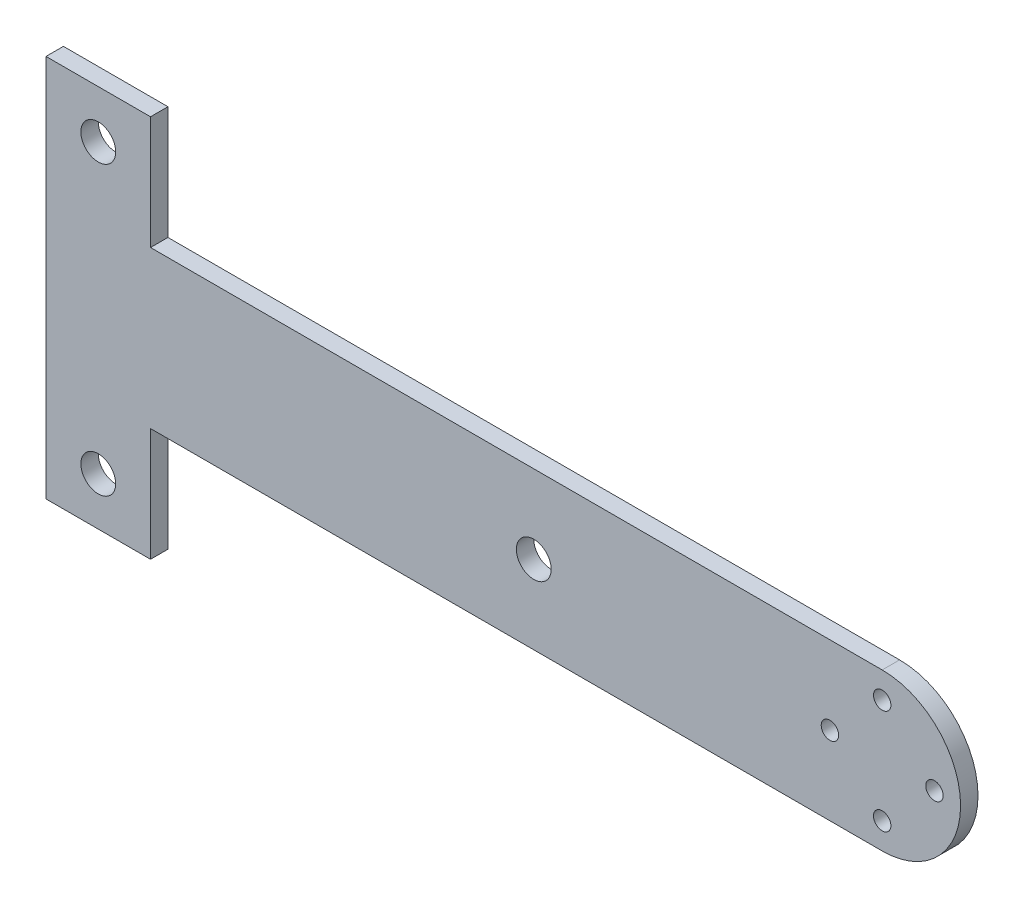
ISO-10303-21;
HEADER;
FILE_DESCRIPTION(('STEP AP214'),'2;1');
FILE_NAME('part.step','',(''),(''),'','','');
FILE_SCHEMA(('AUTOMOTIVE_DESIGN { 1 0 10303 214 1 1 1 1 }'));
ENDSEC;
DATA;
#1=APPLICATION_CONTEXT('core data for automotive mechanical design processes');
#2=APPLICATION_PROTOCOL_DEFINITION('international standard','automotive_design',2000,#1);
#3=PRODUCT_CONTEXT('',#1,'mechanical');
#4=PRODUCT('Part','Part','',(#3));
#5=PRODUCT_RELATED_PRODUCT_CATEGORY('part','',(#4));
#6=PRODUCT_DEFINITION_FORMATION('','',#4);
#7=PRODUCT_DEFINITION_CONTEXT('part definition',#1,'design');
#8=PRODUCT_DEFINITION('design','',#6,#7);
#9=PRODUCT_DEFINITION_SHAPE('','',#8);
#10=(LENGTH_UNIT() NAMED_UNIT(*) SI_UNIT(.MILLI.,.METRE.));
#11=(NAMED_UNIT(*) PLANE_ANGLE_UNIT() SI_UNIT($,.RADIAN.));
#12=(NAMED_UNIT(*) SI_UNIT($,.STERADIAN.) SOLID_ANGLE_UNIT());
#13=UNCERTAINTY_MEASURE_WITH_UNIT(LENGTH_MEASURE(1.E-05),#10,'distance_accuracy_value','');
#14=(GEOMETRIC_REPRESENTATION_CONTEXT(3) GLOBAL_UNCERTAINTY_ASSIGNED_CONTEXT((#13)) GLOBAL_UNIT_ASSIGNED_CONTEXT((#10,
#11,#12)) REPRESENTATION_CONTEXT('',''));
#15=CARTESIAN_POINT('',(0.,0.,0.));
#16=DIRECTION('',(0.,0.,1.));
#17=DIRECTION('',(1.,0.,0.));
#18=AXIS2_PLACEMENT_3D('',#15,#16,#17);
#19=CARTESIAN_POINT('',(41.2764285714286,0.145714285714315,2.));
#20=DIRECTION('',(0.,0.,-1.));
#21=DIRECTION('',(-1.,0.,0.));
#22=AXIS2_PLACEMENT_3D('',#19,#20,#21);
#23=CYLINDRICAL_SURFACE('',#22,9.);
#24=CARTESIAN_POINT('',(41.2764285714286,0.145714285714315,0.));
#25=DIRECTION('',(0.,0.,1.));
#26=DIRECTION('',(1.,0.,0.));
#27=AXIS2_PLACEMENT_3D('',#24,#25,#26);
#28=CIRCLE('',#27,9.);
#29=CARTESIAN_POINT('',(41.2764285714286,9.14571428571432,0.));
#30=VERTEX_POINT('',#29);
#31=CARTESIAN_POINT('',(41.2764285714286,-8.85428571428569,0.));
#32=VERTEX_POINT('',#31);
#33=EDGE_CURVE('E168',#30,#32,#28,.F.);
#34=ORIENTED_EDGE('',*,*,#33,.F.);
#35=DIRECTION('',(0.,0.,-1.));
#36=VECTOR('',#35,1.);
#37=CARTESIAN_POINT('',(41.2764285714286,9.14571428571432,2.));
#38=LINE('',#37,#36);
#39=CARTESIAN_POINT('',(41.2764285714286,9.14571428571432,2.));
#40=VERTEX_POINT('',#39);
#41=EDGE_CURVE('E11',#40,#30,#38,.T.);
#42=ORIENTED_EDGE('',*,*,#41,.F.);
#43=CARTESIAN_POINT('',(41.2764285714286,0.145714285714315,2.));
#44=DIRECTION('',(0.,0.,1.));
#45=DIRECTION('',(1.,0.,0.));
#46=AXIS2_PLACEMENT_3D('',#43,#44,#45);
#47=CIRCLE('',#46,9.);
#48=CARTESIAN_POINT('',(41.2764285714286,-8.85428571428569,2.));
#49=VERTEX_POINT('',#48);
#50=EDGE_CURVE('E297',#40,#49,#47,.F.);
#51=ORIENTED_EDGE('',*,*,#50,.T.);
#52=DIRECTION('',(0.,0.,-1.));
#53=VECTOR('',#52,1.);
#54=CARTESIAN_POINT('',(41.2764285714286,-8.85428571428569,2.));
#55=LINE('',#54,#53);
#56=EDGE_CURVE('E59',#49,#32,#55,.T.);
#57=ORIENTED_EDGE('',*,*,#56,.T.);
#58=EDGE_LOOP('',(#34,#42,#51,#57));
#59=FACE_BOUND('',#58,.T.);
#60=ADVANCED_FACE('F41',(#59),#23,.T.);
#61=CARTESIAN_POINT('',(0.,9.14571428571431,2.));
#62=DIRECTION('',(0.,-1.,0.));
#63=DIRECTION('',(1.,0.,0.));
#64=AXIS2_PLACEMENT_3D('',#61,#62,#63);
#65=PLANE('',#64);
#66=DIRECTION('',(-1.,0.,0.));
#67=VECTOR('',#66,1.);
#68=CARTESIAN_POINT('',(0.,9.14571428571431,0.));
#69=LINE('',#68,#67);
#70=CARTESIAN_POINT('',(-42.7235714285714,9.14571428571431,0.));
#71=VERTEX_POINT('',#70);
#72=EDGE_CURVE('E164',#30,#71,#69,.T.);
#73=ORIENTED_EDGE('',*,*,#72,.T.);
#74=DIRECTION('',(0.,0.,-1.));
#75=VECTOR('',#74,1.);
#76=CARTESIAN_POINT('',(-42.7235714285714,9.14571428571431,2.));
#77=LINE('',#76,#75);
#78=CARTESIAN_POINT('',(-42.7235714285714,9.14571428571431,2.));
#79=VERTEX_POINT('',#78);
#80=EDGE_CURVE('E51',#79,#71,#77,.T.);
#81=ORIENTED_EDGE('',*,*,#80,.F.);
#82=DIRECTION('',(-1.,0.,0.));
#83=VECTOR('',#82,1.);
#84=CARTESIAN_POINT('',(0.,9.14571428571431,2.));
#85=LINE('',#84,#83);
#86=EDGE_CURVE('E300',#40,#79,#85,.T.);
#87=ORIENTED_EDGE('',*,*,#86,.F.);
#88=ORIENTED_EDGE('',*,*,#41,.T.);
#89=EDGE_LOOP('',(#73,#81,#87,#88));
#90=FACE_BOUND('',#89,.T.);
#91=ADVANCED_FACE('F165',(#90),#65,.F.);
#92=CARTESIAN_POINT('',(-42.7235714285714,0.,2.));
#93=DIRECTION('',(-1.,0.,0.));
#94=DIRECTION('',(0.,0.,1.));
#95=AXIS2_PLACEMENT_3D('',#92,#93,#94);
#96=PLANE('',#95);
#97=DIRECTION('',(0.,1.,0.));
#98=VECTOR('',#97,1.);
#99=CARTESIAN_POINT('',(-42.7235714285714,0.,0.));
#100=LINE('',#99,#98);
#101=CARTESIAN_POINT('',(-42.7235714285714,22.1457142857143,0.));
#102=VERTEX_POINT('',#101);
#103=EDGE_CURVE('E158',#71,#102,#100,.T.);
#104=ORIENTED_EDGE('',*,*,#103,.T.);
#105=DIRECTION('',(0.,0.,-1.));
#106=VECTOR('',#105,1.);
#107=CARTESIAN_POINT('',(-42.7235714285714,22.1457142857143,2.));
#108=LINE('',#107,#106);
#109=CARTESIAN_POINT('',(-42.7235714285714,22.1457142857143,2.));
#110=VERTEX_POINT('',#109);
#111=EDGE_CURVE('E147',#110,#102,#108,.T.);
#112=ORIENTED_EDGE('',*,*,#111,.F.);
#113=DIRECTION('',(0.,1.,0.));
#114=VECTOR('',#113,1.);
#115=CARTESIAN_POINT('',(-42.7235714285714,0.,2.));
#116=LINE('',#115,#114);
#117=EDGE_CURVE('E160',#79,#110,#116,.T.);
#118=ORIENTED_EDGE('',*,*,#117,.F.);
#119=ORIENTED_EDGE('',*,*,#80,.T.);
#120=EDGE_LOOP('',(#104,#112,#118,#119));
#121=FACE_BOUND('',#120,.T.);
#122=ADVANCED_FACE('F156',(#121),#96,.F.);
#123=CARTESIAN_POINT('',(0.,22.1457142857143,2.));
#124=DIRECTION('',(0.,-1.,0.));
#125=DIRECTION('',(0.,0.,-1.));
#126=AXIS2_PLACEMENT_3D('',#123,#124,#125);
#127=PLANE('',#126);
#128=DIRECTION('',(-1.,0.,0.));
#129=VECTOR('',#128,1.);
#130=CARTESIAN_POINT('',(0.,22.1457142857143,0.));
#131=LINE('',#130,#129);
#132=CARTESIAN_POINT('',(-54.7235714285714,22.1457142857143,0.));
#133=VERTEX_POINT('',#132);
#134=EDGE_CURVE('E172',#102,#133,#131,.T.);
#135=ORIENTED_EDGE('',*,*,#134,.T.);
#136=DIRECTION('',(0.,0.,-1.));
#137=VECTOR('',#136,1.);
#138=CARTESIAN_POINT('',(-54.7235714285714,22.1457142857143,2.));
#139=LINE('',#138,#137);
#140=CARTESIAN_POINT('',(-54.7235714285714,22.1457142857143,2.));
#141=VERTEX_POINT('',#140);
#142=EDGE_CURVE('E139',#141,#133,#139,.T.);
#143=ORIENTED_EDGE('',*,*,#142,.F.);
#144=DIRECTION('',(-1.,0.,0.));
#145=VECTOR('',#144,1.);
#146=CARTESIAN_POINT('',(0.,22.1457142857143,2.));
#147=LINE('',#146,#145);
#148=EDGE_CURVE('E307',#110,#141,#147,.T.);
#149=ORIENTED_EDGE('',*,*,#148,.F.);
#150=ORIENTED_EDGE('',*,*,#111,.T.);
#151=EDGE_LOOP('',(#135,#143,#149,#150));
#152=FACE_BOUND('',#151,.T.);
#153=ADVANCED_FACE('F258',(#152),#127,.F.);
#154=CARTESIAN_POINT('',(-54.7235714285714,0.,2.));
#155=DIRECTION('',(1.,0.,0.));
#156=DIRECTION('',(0.,0.,-1.));
#157=AXIS2_PLACEMENT_3D('',#154,#155,#156);
#158=PLANE('',#157);
#159=DIRECTION('',(0.,-1.,0.));
#160=VECTOR('',#159,1.);
#161=CARTESIAN_POINT('',(-54.7235714285714,0.,0.));
#162=LINE('',#161,#160);
#163=CARTESIAN_POINT('',(-54.7235714285714,-21.8542857142857,0.));
#164=VERTEX_POINT('',#163);
#165=EDGE_CURVE('E181',#133,#164,#162,.T.);
#166=ORIENTED_EDGE('',*,*,#165,.T.);
#167=DIRECTION('',(0.,0.,-1.));
#168=VECTOR('',#167,1.);
#169=CARTESIAN_POINT('',(-54.7235714285714,-21.8542857142857,2.));
#170=LINE('',#169,#168);
#171=CARTESIAN_POINT('',(-54.7235714285714,-21.8542857142857,2.));
#172=VERTEX_POINT('',#171);
#173=EDGE_CURVE('E135',#172,#164,#170,.T.);
#174=ORIENTED_EDGE('',*,*,#173,.F.);
#175=DIRECTION('',(0.,-1.,0.));
#176=VECTOR('',#175,1.);
#177=CARTESIAN_POINT('',(-54.7235714285714,0.,2.));
#178=LINE('',#177,#176);
#179=EDGE_CURVE('E126',#141,#172,#178,.T.);
#180=ORIENTED_EDGE('',*,*,#179,.F.);
#181=ORIENTED_EDGE('',*,*,#142,.T.);
#182=EDGE_LOOP('',(#166,#174,#180,#181));
#183=FACE_BOUND('',#182,.T.);
#184=ADVANCED_FACE('F261',(#183),#158,.F.);
#185=CARTESIAN_POINT('',(0.,-21.8542857142857,2.));
#186=DIRECTION('',(0.,1.,0.));
#187=DIRECTION('',(0.,0.,1.));
#188=AXIS2_PLACEMENT_3D('',#185,#186,#187);
#189=PLANE('',#188);
#190=DIRECTION('',(1.,0.,0.));
#191=VECTOR('',#190,1.);
#192=CARTESIAN_POINT('',(0.,-21.8542857142857,0.));
#193=LINE('',#192,#191);
#194=CARTESIAN_POINT('',(-42.7235714285714,-21.8542857142857,0.));
#195=VERTEX_POINT('',#194);
#196=EDGE_CURVE('E133',#164,#195,#193,.T.);
#197=ORIENTED_EDGE('',*,*,#196,.T.);
#198=DIRECTION('',(0.,0.,-1.));
#199=VECTOR('',#198,1.);
#200=CARTESIAN_POINT('',(-42.7235714285714,-21.8542857142857,2.));
#201=LINE('',#200,#199);
#202=CARTESIAN_POINT('',(-42.7235714285714,-21.8542857142857,2.));
#203=VERTEX_POINT('',#202);
#204=EDGE_CURVE('E113',#203,#195,#201,.T.);
#205=ORIENTED_EDGE('',*,*,#204,.F.);
#206=DIRECTION('',(1.,0.,0.));
#207=VECTOR('',#206,1.);
#208=CARTESIAN_POINT('',(0.,-21.8542857142857,2.));
#209=LINE('',#208,#207);
#210=EDGE_CURVE('E119',#172,#203,#209,.T.);
#211=ORIENTED_EDGE('',*,*,#210,.F.);
#212=ORIENTED_EDGE('',*,*,#173,.T.);
#213=EDGE_LOOP('',(#197,#205,#211,#212));
#214=FACE_BOUND('',#213,.T.);
#215=ADVANCED_FACE('F132',(#214),#189,.F.);
#216=CARTESIAN_POINT('',(-42.7235714285714,0.,2.));
#217=DIRECTION('',(-1.,0.,0.));
#218=DIRECTION('',(0.,-1.,0.));
#219=AXIS2_PLACEMENT_3D('',#216,#217,#218);
#220=PLANE('',#219);
#221=DIRECTION('',(0.,1.,0.));
#222=VECTOR('',#221,1.);
#223=CARTESIAN_POINT('',(-42.7235714285714,0.,0.));
#224=LINE('',#223,#222);
#225=CARTESIAN_POINT('',(-42.7235714285714,-8.8542857142857,0.));
#226=VERTEX_POINT('',#225);
#227=EDGE_CURVE('E187',#195,#226,#224,.T.);
#228=ORIENTED_EDGE('',*,*,#227,.T.);
#229=DIRECTION('',(0.,0.,-1.));
#230=VECTOR('',#229,1.);
#231=CARTESIAN_POINT('',(-42.7235714285714,-8.8542857142857,2.));
#232=LINE('',#231,#230);
#233=CARTESIAN_POINT('',(-42.7235714285714,-8.8542857142857,2.));
#234=VERTEX_POINT('',#233);
#235=EDGE_CURVE('E85',#234,#226,#232,.T.);
#236=ORIENTED_EDGE('',*,*,#235,.F.);
#237=DIRECTION('',(0.,1.,0.));
#238=VECTOR('',#237,1.);
#239=CARTESIAN_POINT('',(-42.7235714285714,0.,2.));
#240=LINE('',#239,#238);
#241=EDGE_CURVE('E109',#203,#234,#240,.T.);
#242=ORIENTED_EDGE('',*,*,#241,.F.);
#243=ORIENTED_EDGE('',*,*,#204,.T.);
#244=EDGE_LOOP('',(#228,#236,#242,#243));
#245=FACE_BOUND('',#244,.T.);
#246=ADVANCED_FACE('F111',(#245),#220,.F.);
#247=CARTESIAN_POINT('',(-48.7235714285714,16.6457142857143,2.));
#248=DIRECTION('',(0.,0.,-1.));
#249=DIRECTION('',(-1.,0.,0.));
#250=AXIS2_PLACEMENT_3D('',#247,#248,#249);
#251=CYLINDRICAL_SURFACE('',#250,2.);
#252=CARTESIAN_POINT('',(-48.7235714285714,16.6457142857143,2.));
#253=DIRECTION('',(0.,0.,1.));
#254=DIRECTION('',(1.,0.,0.));
#255=AXIS2_PLACEMENT_3D('',#252,#253,#254);
#256=CIRCLE('',#255,2.);
#257=CARTESIAN_POINT('',(-46.7235714285714,16.6457142857143,2.));
#258=VERTEX_POINT('',#257);
#259=EDGE_CURVE('E222',#258,#258,#256,.T.);
#260=ORIENTED_EDGE('',*,*,#259,.T.);
#261=EDGE_LOOP('',(#260));
#262=FACE_BOUND('',#261,.T.);
#263=CARTESIAN_POINT('',(-48.7235714285714,16.6457142857143,0.));
#264=DIRECTION('',(0.,0.,1.));
#265=DIRECTION('',(1.,0.,0.));
#266=AXIS2_PLACEMENT_3D('',#263,#264,#265);
#267=CIRCLE('',#266,2.);
#268=CARTESIAN_POINT('',(-46.7235714285714,16.6457142857143,0.));
#269=VERTEX_POINT('',#268);
#270=EDGE_CURVE('E210',#269,#269,#267,.T.);
#271=ORIENTED_EDGE('',*,*,#270,.F.);
#272=EDGE_LOOP('',(#271));
#273=FACE_BOUND('',#272,.T.);
#274=ADVANCED_FACE('F269',(#262,#273),#251,.F.);
#275=CARTESIAN_POINT('',(1.27642857142862,0.145714285714315,2.));
#276=DIRECTION('',(0.,0.,-1.));
#277=DIRECTION('',(-1.,0.,0.));
#278=AXIS2_PLACEMENT_3D('',#275,#276,#277);
#279=CYLINDRICAL_SURFACE('',#278,2.);
#280=CARTESIAN_POINT('',(1.27642857142862,0.145714285714315,2.));
#281=DIRECTION('',(0.,0.,1.));
#282=DIRECTION('',(1.,0.,0.));
#283=AXIS2_PLACEMENT_3D('',#280,#281,#282);
#284=CIRCLE('',#283,2.);
#285=CARTESIAN_POINT('',(3.27642857142862,0.145714285714315,2.));
#286=VERTEX_POINT('',#285);
#287=EDGE_CURVE('E228',#286,#286,#284,.T.);
#288=ORIENTED_EDGE('',*,*,#287,.T.);
#289=EDGE_LOOP('',(#288));
#290=FACE_BOUND('',#289,.T.);
#291=CARTESIAN_POINT('',(1.27642857142862,0.145714285714315,0.));
#292=DIRECTION('',(0.,0.,1.));
#293=DIRECTION('',(1.,0.,0.));
#294=AXIS2_PLACEMENT_3D('',#291,#292,#293);
#295=CIRCLE('',#294,2.);
#296=CARTESIAN_POINT('',(3.27642857142862,0.145714285714315,0.));
#297=VERTEX_POINT('',#296);
#298=EDGE_CURVE('E206',#297,#297,#295,.T.);
#299=ORIENTED_EDGE('',*,*,#298,.F.);
#300=EDGE_LOOP('',(#299));
#301=FACE_BOUND('',#300,.T.);
#302=ADVANCED_FACE('F281',(#290,#301),#279,.F.);
#303=CARTESIAN_POINT('',(47.2764285714288,0.145714285714464,2.));
#304=DIRECTION('',(0.,0.,-1.));
#305=DIRECTION('',(-1.,0.,0.));
#306=AXIS2_PLACEMENT_3D('',#303,#304,#305);
#307=CYLINDRICAL_SURFACE('',#306,0.999999999999998);
#308=CARTESIAN_POINT('',(47.2764285714288,0.145714285714464,2.));
#309=DIRECTION('',(0.,0.,1.));
#310=DIRECTION('',(1.,0.,0.));
#311=AXIS2_PLACEMENT_3D('',#308,#309,#310);
#312=CIRCLE('',#311,0.999999999999998);
#313=CARTESIAN_POINT('',(48.2764285714288,0.145714285714464,2.));
#314=VERTEX_POINT('',#313);
#315=EDGE_CURVE('E322',#314,#314,#312,.T.);
#316=ORIENTED_EDGE('',*,*,#315,.T.);
#317=EDGE_LOOP('',(#316));
#318=FACE_BOUND('',#317,.T.);
#319=CARTESIAN_POINT('',(47.2764285714288,0.145714285714464,0.));
#320=DIRECTION('',(0.,0.,1.));
#321=DIRECTION('',(1.,0.,0.));
#322=AXIS2_PLACEMENT_3D('',#319,#320,#321);
#323=CIRCLE('',#322,0.999999999999998);
#324=CARTESIAN_POINT('',(48.2764285714288,0.145714285714464,0.));
#325=VERTEX_POINT('',#324);
#326=EDGE_CURVE('E202',#325,#325,#323,.T.);
#327=ORIENTED_EDGE('',*,*,#326,.F.);
#328=EDGE_LOOP('',(#327));
#329=FACE_BOUND('',#328,.T.);
#330=ADVANCED_FACE('F277',(#318,#329),#307,.F.);
#331=CARTESIAN_POINT('',(41.2764285714289,-5.85428571428569,2.));
#332=DIRECTION('',(0.,0.,-1.));
#333=DIRECTION('',(-1.,0.,0.));
#334=AXIS2_PLACEMENT_3D('',#331,#332,#333);
#335=CYLINDRICAL_SURFACE('',#334,0.999999999999998);
#336=CARTESIAN_POINT('',(41.2764285714289,-5.85428571428569,2.));
#337=DIRECTION('',(0.,0.,1.));
#338=DIRECTION('',(1.,0.,0.));
#339=AXIS2_PLACEMENT_3D('',#336,#337,#338);
#340=CIRCLE('',#339,0.999999999999998);
#341=CARTESIAN_POINT('',(42.2764285714289,-5.85428571428569,2.));
#342=VERTEX_POINT('',#341);
#343=EDGE_CURVE('E318',#342,#342,#340,.T.);
#344=ORIENTED_EDGE('',*,*,#343,.T.);
#345=EDGE_LOOP('',(#344));
#346=FACE_BOUND('',#345,.T.);
#347=CARTESIAN_POINT('',(41.2764285714289,-5.85428571428569,0.));
#348=DIRECTION('',(0.,0.,1.));
#349=DIRECTION('',(1.,0.,0.));
#350=AXIS2_PLACEMENT_3D('',#347,#348,#349);
#351=CIRCLE('',#350,0.999999999999998);
#352=CARTESIAN_POINT('',(42.2764285714289,-5.85428571428569,0.));
#353=VERTEX_POINT('',#352);
#354=EDGE_CURVE('E198',#353,#353,#351,.T.);
#355=ORIENTED_EDGE('',*,*,#354,.F.);
#356=EDGE_LOOP('',(#355));
#357=FACE_BOUND('',#356,.T.);
#358=ADVANCED_FACE('F273',(#346,#357),#335,.F.);
#359=CARTESIAN_POINT('',(35.2764285714288,0.145714285714214,2.));
#360=DIRECTION('',(0.,0.,-1.));
#361=DIRECTION('',(-1.,0.,0.));
#362=AXIS2_PLACEMENT_3D('',#359,#360,#361);
#363=CYLINDRICAL_SURFACE('',#362,0.999999999999998);
#364=CARTESIAN_POINT('',(35.2764285714288,0.145714285714214,2.));
#365=DIRECTION('',(0.,0.,1.));
#366=DIRECTION('',(1.,0.,0.));
#367=AXIS2_PLACEMENT_3D('',#364,#365,#366);
#368=CIRCLE('',#367,0.999999999999998);
#369=CARTESIAN_POINT('',(36.2764285714288,0.145714285714214,2.));
#370=VERTEX_POINT('',#369);
#371=EDGE_CURVE('E314',#370,#370,#368,.T.);
#372=ORIENTED_EDGE('',*,*,#371,.T.);
#373=EDGE_LOOP('',(#372));
#374=FACE_BOUND('',#373,.T.);
#375=CARTESIAN_POINT('',(35.2764285714288,0.145714285714214,0.));
#376=DIRECTION('',(0.,0.,1.));
#377=DIRECTION('',(1.,0.,0.));
#378=AXIS2_PLACEMENT_3D('',#375,#376,#377);
#379=CIRCLE('',#378,0.999999999999998);
#380=CARTESIAN_POINT('',(36.2764285714288,0.145714285714214,0.));
#381=VERTEX_POINT('',#380);
#382=EDGE_CURVE('E194',#381,#381,#379,.T.);
#383=ORIENTED_EDGE('',*,*,#382,.F.);
#384=EDGE_LOOP('',(#383));
#385=FACE_BOUND('',#384,.T.);
#386=ADVANCED_FACE('F247',(#374,#385),#363,.F.);
#387=CARTESIAN_POINT('',(0.,-8.85428571428569,2.));
#388=DIRECTION('',(0.,-1.,0.));
#389=DIRECTION('',(1.,0.,0.));
#390=AXIS2_PLACEMENT_3D('',#387,#388,#389);
#391=PLANE('',#390);
#392=DIRECTION('',(-1.,0.,0.));
#393=VECTOR('',#392,1.);
#394=CARTESIAN_POINT('',(0.,-8.85428571428569,0.));
#395=LINE('',#394,#393);
#396=EDGE_CURVE('E190',#32,#226,#395,.T.);
#397=ORIENTED_EDGE('',*,*,#396,.F.);
#398=ORIENTED_EDGE('',*,*,#56,.F.);
#399=DIRECTION('',(-1.,0.,0.));
#400=VECTOR('',#399,1.);
#401=CARTESIAN_POINT('',(0.,-8.85428571428569,2.));
#402=LINE('',#401,#400);
#403=EDGE_CURVE('E118',#49,#234,#402,.T.);
#404=ORIENTED_EDGE('',*,*,#403,.T.);
#405=ORIENTED_EDGE('',*,*,#235,.T.);
#406=EDGE_LOOP('',(#397,#398,#404,#405));
#407=FACE_BOUND('',#406,.T.);
#408=ADVANCED_FACE('F239',(#407),#391,.T.);
#409=CARTESIAN_POINT('',(41.2764285714286,6.14571428571432,2.));
#410=DIRECTION('',(0.,0.,-1.));
#411=DIRECTION('',(-1.,0.,0.));
#412=AXIS2_PLACEMENT_3D('',#409,#410,#411);
#413=CYLINDRICAL_SURFACE('',#412,0.999999999999998);
#414=CARTESIAN_POINT('',(41.2764285714286,6.14571428571432,2.));
#415=DIRECTION('',(0.,0.,1.));
#416=DIRECTION('',(1.,0.,0.));
#417=AXIS2_PLACEMENT_3D('',#414,#415,#416);
#418=CIRCLE('',#417,0.999999999999998);
#419=CARTESIAN_POINT('',(42.2764285714286,6.14571428571432,2.));
#420=VERTEX_POINT('',#419);
#421=EDGE_CURVE('E217',#420,#420,#418,.T.);
#422=ORIENTED_EDGE('',*,*,#421,.T.);
#423=EDGE_LOOP('',(#422));
#424=FACE_BOUND('',#423,.T.);
#425=CARTESIAN_POINT('',(41.2764285714286,6.14571428571432,0.));
#426=DIRECTION('',(0.,0.,1.));
#427=DIRECTION('',(1.,0.,0.));
#428=AXIS2_PLACEMENT_3D('',#425,#426,#427);
#429=CIRCLE('',#428,0.999999999999998);
#430=CARTESIAN_POINT('',(42.2764285714286,6.14571428571432,0.));
#431=VERTEX_POINT('',#430);
#432=EDGE_CURVE('E174',#431,#431,#429,.T.);
#433=ORIENTED_EDGE('',*,*,#432,.F.);
#434=EDGE_LOOP('',(#433));
#435=FACE_BOUND('',#434,.T.);
#436=ADVANCED_FACE('F43',(#424,#435),#413,.F.);
#437=CARTESIAN_POINT('',(-48.7235714285714,-16.3542857142857,2.));
#438=DIRECTION('',(0.,0.,-1.));
#439=DIRECTION('',(-1.,0.,0.));
#440=AXIS2_PLACEMENT_3D('',#437,#438,#439);
#441=CYLINDRICAL_SURFACE('',#440,2.);
#442=CARTESIAN_POINT('',(-48.7235714285714,-16.3542857142857,2.));
#443=DIRECTION('',(0.,0.,1.));
#444=DIRECTION('',(1.,0.,0.));
#445=AXIS2_PLACEMENT_3D('',#442,#443,#444);
#446=CIRCLE('',#445,2.);
#447=CARTESIAN_POINT('',(-46.7235714285714,-16.3542857142857,2.));
#448=VERTEX_POINT('',#447);
#449=EDGE_CURVE('E219',#448,#448,#446,.F.);
#450=ORIENTED_EDGE('',*,*,#449,.F.);
#451=EDGE_LOOP('',(#450));
#452=FACE_BOUND('',#451,.T.);
#453=CARTESIAN_POINT('',(-48.7235714285714,-16.3542857142857,0.));
#454=DIRECTION('',(0.,0.,1.));
#455=DIRECTION('',(1.,0.,0.));
#456=AXIS2_PLACEMENT_3D('',#453,#454,#455);
#457=CIRCLE('',#456,2.);
#458=CARTESIAN_POINT('',(-46.7235714285714,-16.3542857142857,0.));
#459=VERTEX_POINT('',#458);
#460=EDGE_CURVE('E214',#459,#459,#457,.F.);
#461=ORIENTED_EDGE('',*,*,#460,.T.);
#462=EDGE_LOOP('',(#461));
#463=FACE_BOUND('',#462,.T.);
#464=ADVANCED_FACE('F238',(#452,#463),#441,.F.);
#465=CARTESIAN_POINT('',(0.,0.,2.));
#466=DIRECTION('',(0.,0.,1.));
#467=DIRECTION('',(1.,0.,0.));
#468=AXIS2_PLACEMENT_3D('',#465,#466,#467);
#469=PLANE('',#468);
#470=ORIENTED_EDGE('',*,*,#421,.F.);
#471=EDGE_LOOP('',(#470));
#472=FACE_BOUND('',#471,.T.);
#473=ORIENTED_EDGE('',*,*,#50,.F.);
#474=ORIENTED_EDGE('',*,*,#86,.T.);
#475=ORIENTED_EDGE('',*,*,#117,.T.);
#476=ORIENTED_EDGE('',*,*,#148,.T.);
#477=ORIENTED_EDGE('',*,*,#179,.T.);
#478=ORIENTED_EDGE('',*,*,#210,.T.);
#479=ORIENTED_EDGE('',*,*,#241,.T.);
#480=ORIENTED_EDGE('',*,*,#403,.F.);
#481=EDGE_LOOP('',(#473,#474,#475,#476,#477,#478,#479,#480));
#482=FACE_BOUND('',#481,.T.);
#483=ORIENTED_EDGE('',*,*,#371,.F.);
#484=EDGE_LOOP('',(#483));
#485=FACE_BOUND('',#484,.T.);
#486=ORIENTED_EDGE('',*,*,#343,.F.);
#487=EDGE_LOOP('',(#486));
#488=FACE_BOUND('',#487,.T.);
#489=ORIENTED_EDGE('',*,*,#315,.F.);
#490=EDGE_LOOP('',(#489));
#491=FACE_BOUND('',#490,.T.);
#492=ORIENTED_EDGE('',*,*,#287,.F.);
#493=EDGE_LOOP('',(#492));
#494=FACE_BOUND('',#493,.T.);
#495=ORIENTED_EDGE('',*,*,#259,.F.);
#496=EDGE_LOOP('',(#495));
#497=FACE_BOUND('',#496,.T.);
#498=ORIENTED_EDGE('',*,*,#449,.T.);
#499=EDGE_LOOP('',(#498));
#500=FACE_BOUND('',#499,.T.);
#501=ADVANCED_FACE('F123',(#472,#482,#485,#488,#491,#494,#497,#500),#469,.T.);
#502=CARTESIAN_POINT('',(0.,0.,0.));
#503=DIRECTION('',(0.,0.,1.));
#504=DIRECTION('',(1.,0.,0.));
#505=AXIS2_PLACEMENT_3D('',#502,#503,#504);
#506=PLANE('',#505);
#507=ORIENTED_EDGE('',*,*,#432,.T.);
#508=EDGE_LOOP('',(#507));
#509=FACE_BOUND('',#508,.T.);
#510=ORIENTED_EDGE('',*,*,#33,.T.);
#511=ORIENTED_EDGE('',*,*,#396,.T.);
#512=ORIENTED_EDGE('',*,*,#227,.F.);
#513=ORIENTED_EDGE('',*,*,#196,.F.);
#514=ORIENTED_EDGE('',*,*,#165,.F.);
#515=ORIENTED_EDGE('',*,*,#134,.F.);
#516=ORIENTED_EDGE('',*,*,#103,.F.);
#517=ORIENTED_EDGE('',*,*,#72,.F.);
#518=EDGE_LOOP('',(#510,#511,#512,#513,#514,#515,#516,#517));
#519=FACE_BOUND('',#518,.T.);
#520=ORIENTED_EDGE('',*,*,#382,.T.);
#521=EDGE_LOOP('',(#520));
#522=FACE_BOUND('',#521,.T.);
#523=ORIENTED_EDGE('',*,*,#354,.T.);
#524=EDGE_LOOP('',(#523));
#525=FACE_BOUND('',#524,.T.);
#526=ORIENTED_EDGE('',*,*,#326,.T.);
#527=EDGE_LOOP('',(#526));
#528=FACE_BOUND('',#527,.T.);
#529=ORIENTED_EDGE('',*,*,#298,.T.);
#530=EDGE_LOOP('',(#529));
#531=FACE_BOUND('',#530,.T.);
#532=ORIENTED_EDGE('',*,*,#270,.T.);
#533=EDGE_LOOP('',(#532));
#534=FACE_BOUND('',#533,.T.);
#535=ORIENTED_EDGE('',*,*,#460,.F.);
#536=EDGE_LOOP('',(#535));
#537=FACE_BOUND('',#536,.T.);
#538=ADVANCED_FACE('F235',(#509,#519,#522,#525,#528,#531,#534,#537),#506,.F.);
#539=CLOSED_SHELL('',(#60,#91,#122,#153,#184,#215,#246,#274,#302,#330,#358,#386,#408,#436,#464,
#501,#538));
#540=MANIFOLD_SOLID_BREP('B2',#539);
#541=ADVANCED_BREP_SHAPE_REPRESENTATION('',(#18,#540),#14);
#542=SHAPE_DEFINITION_REPRESENTATION(#9,#541);
ENDSEC;
END-ISO-10303-21;
